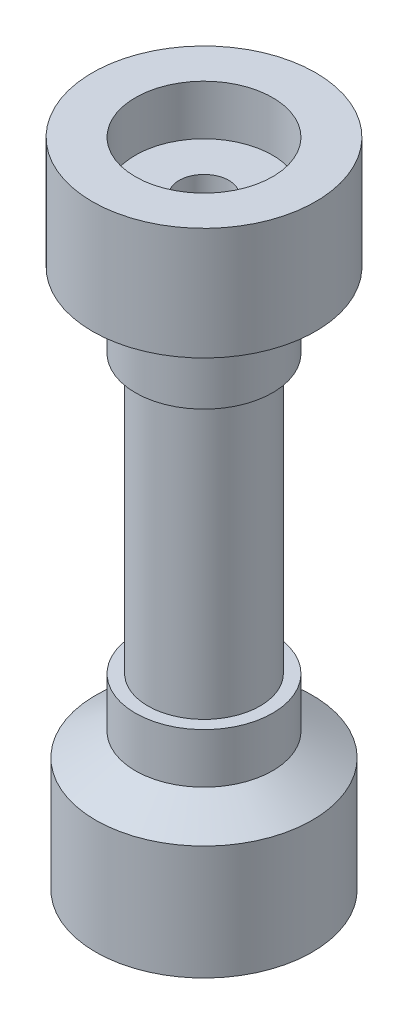
ISO-10303-21;
HEADER;
FILE_DESCRIPTION(('STEP AP214'),'2;1');
FILE_NAME('part.step','',(''),(''),'','','');
FILE_SCHEMA(('AUTOMOTIVE_DESIGN { 1 0 10303 214 1 1 1 1 }'));
ENDSEC;
DATA;
#1=APPLICATION_CONTEXT('core data for automotive mechanical design processes');
#2=APPLICATION_PROTOCOL_DEFINITION('international standard','automotive_design',2000,#1);
#3=PRODUCT_CONTEXT('',#1,'mechanical');
#4=PRODUCT('Part','Part','',(#3));
#5=PRODUCT_RELATED_PRODUCT_CATEGORY('part','',(#4));
#6=PRODUCT_DEFINITION_FORMATION('','',#4);
#7=PRODUCT_DEFINITION_CONTEXT('part definition',#1,'design');
#8=PRODUCT_DEFINITION('design','',#6,#7);
#9=PRODUCT_DEFINITION_SHAPE('','',#8);
#10=(LENGTH_UNIT() NAMED_UNIT(*) SI_UNIT(.MILLI.,.METRE.));
#11=(NAMED_UNIT(*) PLANE_ANGLE_UNIT() SI_UNIT($,.RADIAN.));
#12=(NAMED_UNIT(*) SI_UNIT($,.STERADIAN.) SOLID_ANGLE_UNIT());
#13=UNCERTAINTY_MEASURE_WITH_UNIT(LENGTH_MEASURE(1.E-05),#10,'distance_accuracy_value','');
#14=(GEOMETRIC_REPRESENTATION_CONTEXT(3) GLOBAL_UNCERTAINTY_ASSIGNED_CONTEXT((#13)) GLOBAL_UNIT_ASSIGNED_CONTEXT((#10,
#11,#12)) REPRESENTATION_CONTEXT('',''));
#15=CARTESIAN_POINT('',(0.,0.,0.));
#16=DIRECTION('',(0.,0.,1.));
#17=DIRECTION('',(1.,0.,0.));
#18=AXIS2_PLACEMENT_3D('',#15,#16,#17);
#19=CARTESIAN_POINT('',(0.,18.438364037633,0.));
#20=DIRECTION('',(0.,-1.,0.));
#21=DIRECTION('',(0.,0.,-1.));
#22=AXIS2_PLACEMENT_3D('',#19,#20,#21);
#23=PLANE('',#22);
#24=CARTESIAN_POINT('',(0.,18.438364037633,4.96669425090892));
#25=DIRECTION('',(0.,1.,0.));
#26=DIRECTION('',(0.,0.,1.));
#27=AXIS2_PLACEMENT_3D('',#24,#25,#26);
#28=CIRCLE('',#27,11.43);
#29=CARTESIAN_POINT('',(0.,18.438364037633,16.3966942509089));
#30=VERTEX_POINT('',#29);
#31=EDGE_CURVE('E85',#30,#30,#28,.T.);
#32=ORIENTED_EDGE('',*,*,#31,.F.);
#33=EDGE_LOOP('',(#32));
#34=FACE_BOUND('',#33,.T.);
#35=CARTESIAN_POINT('',(0.,18.438364037633,4.96669425090892));
#36=DIRECTION('',(0.,1.,0.));
#37=DIRECTION('',(0.,0.,1.));
#38=AXIS2_PLACEMENT_3D('',#35,#36,#37);
#39=CIRCLE('',#38,13.97);
#40=CARTESIAN_POINT('',(0.,18.438364037633,18.9366942509089));
#41=VERTEX_POINT('',#40);
#42=EDGE_CURVE('E10',#41,#41,#39,.T.);
#43=ORIENTED_EDGE('',*,*,#42,.T.);
#44=EDGE_LOOP('',(#43));
#45=FACE_BOUND('',#44,.T.);
#46=ADVANCED_FACE('F33',(#34,#45),#23,.F.);
#47=CARTESIAN_POINT('',(0.,-21.2869411304957,4.96669425090891));
#48=DIRECTION('',(0.,1.,0.));
#49=DIRECTION('',(0.,0.,1.));
#50=AXIS2_PLACEMENT_3D('',#47,#48,#49);
#51=CYLINDRICAL_SURFACE('',#50,13.97);
#52=ORIENTED_EDGE('',*,*,#42,.F.);
#53=EDGE_LOOP('',(#52));
#54=FACE_BOUND('',#53,.T.);
#55=CARTESIAN_POINT('',(0.,8.27836403763305,4.96669425090892));
#56=DIRECTION('',(0.,1.,0.));
#57=DIRECTION('',(0.,0.,1.));
#58=AXIS2_PLACEMENT_3D('',#55,#56,#57);
#59=CIRCLE('',#58,13.97);
#60=CARTESIAN_POINT('',(0.,8.27836403763305,18.9366942509089));
#61=VERTEX_POINT('',#60);
#62=EDGE_CURVE('E39',#61,#61,#59,.T.);
#63=ORIENTED_EDGE('',*,*,#62,.T.);
#64=EDGE_LOOP('',(#63));
#65=FACE_BOUND('',#64,.T.);
#66=ADVANCED_FACE('F93',(#54,#65),#51,.T.);
#67=CARTESIAN_POINT('',(0.,8.27836403763305,4.96669425090892));
#68=DIRECTION('',(0.,-1.,0.));
#69=DIRECTION('',(0.,0.,-1.));
#70=AXIS2_PLACEMENT_3D('',#67,#68,#69);
#71=CONICAL_SURFACE('',#70,13.97,1.04719755119659);
#72=CARTESIAN_POINT('',(0.,3.61092571762528,4.96669425090891));
#73=DIRECTION('',(0.,1.,0.));
#74=DIRECTION('',(0.,0.,1.));
#75=AXIS2_PLACEMENT_3D('',#72,#73,#74);
#76=CIRCLE('',#75,22.0542403114473);
#77=CARTESIAN_POINT('',(0.,3.61092571762528,27.0209345623562));
#78=VERTEX_POINT('',#77);
#79=EDGE_CURVE('E43',#78,#78,#76,.T.);
#80=ORIENTED_EDGE('',*,*,#79,.T.);
#81=EDGE_LOOP('',(#80));
#82=FACE_BOUND('',#81,.T.);
#83=ORIENTED_EDGE('',*,*,#62,.F.);
#84=EDGE_LOOP('',(#83));
#85=FACE_BOUND('',#84,.T.);
#86=ADVANCED_FACE('F97',(#82,#85),#71,.T.);
#87=CARTESIAN_POINT('',(0.,-21.2869411304957,4.96669425090891));
#88=DIRECTION('',(0.,1.,0.));
#89=DIRECTION('',(0.,0.,1.));
#90=AXIS2_PLACEMENT_3D('',#87,#88,#89);
#91=CYLINDRICAL_SURFACE('',#90,22.0542403114473);
#92=CARTESIAN_POINT('',(0.,-19.661635962367,4.96669425090891));
#93=DIRECTION('',(0.,1.,0.));
#94=DIRECTION('',(0.,0.,1.));
#95=AXIS2_PLACEMENT_3D('',#92,#93,#94);
#96=CIRCLE('',#95,22.0542403114473);
#97=CARTESIAN_POINT('',(0.,-19.661635962367,27.0209345623562));
#98=VERTEX_POINT('',#97);
#99=EDGE_CURVE('E47',#98,#98,#96,.T.);
#100=ORIENTED_EDGE('',*,*,#99,.T.);
#101=EDGE_LOOP('',(#100));
#102=FACE_BOUND('',#101,.T.);
#103=ORIENTED_EDGE('',*,*,#79,.F.);
#104=EDGE_LOOP('',(#103));
#105=FACE_BOUND('',#104,.T.);
#106=ADVANCED_FACE('F102',(#102,#105),#91,.T.);
#107=CARTESIAN_POINT('',(0.,-19.661635962367,0.));
#108=DIRECTION('',(0.,1.,0.));
#109=DIRECTION('',(0.,0.,1.));
#110=AXIS2_PLACEMENT_3D('',#107,#108,#109);
#111=PLANE('',#110);
#112=ORIENTED_EDGE('',*,*,#99,.F.);
#113=EDGE_LOOP('',(#112));
#114=FACE_BOUND('',#113,.T.);
#115=CARTESIAN_POINT('',(0.,-19.661635962367,4.96669425090891));
#116=DIRECTION('',(0.,1.,0.));
#117=DIRECTION('',(0.,0.,1.));
#118=AXIS2_PLACEMENT_3D('',#115,#116,#117);
#119=CIRCLE('',#118,13.97);
#120=CARTESIAN_POINT('',(0.,-19.661635962367,18.9366942509089));
#121=VERTEX_POINT('',#120);
#122=EDGE_CURVE('E52',#121,#121,#119,.T.);
#123=ORIENTED_EDGE('',*,*,#122,.T.);
#124=EDGE_LOOP('',(#123));
#125=FACE_BOUND('',#124,.T.);
#126=ADVANCED_FACE('F108',(#114,#125),#111,.F.);
#127=CARTESIAN_POINT('',(0.,-21.2869411304957,4.96669425090891));
#128=DIRECTION('',(0.,1.,0.));
#129=DIRECTION('',(0.,0.,1.));
#130=AXIS2_PLACEMENT_3D('',#127,#128,#129);
#131=CYLINDRICAL_SURFACE('',#130,13.97);
#132=CARTESIAN_POINT('',(0.,-9.50163596236696,4.96669425090891));
#133=DIRECTION('',(0.,1.,0.));
#134=DIRECTION('',(0.,0.,1.));
#135=AXIS2_PLACEMENT_3D('',#132,#133,#134);
#136=CIRCLE('',#135,13.97);
#137=CARTESIAN_POINT('',(0.,-9.50163596236696,18.9366942509089));
#138=VERTEX_POINT('',#137);
#139=EDGE_CURVE('E55',#138,#138,#136,.T.);
#140=ORIENTED_EDGE('',*,*,#139,.T.);
#141=EDGE_LOOP('',(#140));
#142=FACE_BOUND('',#141,.T.);
#143=ORIENTED_EDGE('',*,*,#122,.F.);
#144=EDGE_LOOP('',(#143));
#145=FACE_BOUND('',#144,.T.);
#146=ADVANCED_FACE('F112',(#142,#145),#131,.F.);
#147=CARTESIAN_POINT('',(0.,-9.50163596236696,0.));
#148=DIRECTION('',(0.,-1.,0.));
#149=DIRECTION('',(0.,0.,-1.));
#150=AXIS2_PLACEMENT_3D('',#147,#148,#149);
#151=PLANE('',#150);
#152=CARTESIAN_POINT('',(0.,-9.50163596236696,4.96669425090891));
#153=DIRECTION('',(0.,1.,0.));
#154=DIRECTION('',(0.,0.,1.));
#155=AXIS2_PLACEMENT_3D('',#152,#153,#154);
#156=CIRCLE('',#155,5.07999999999997);
#157=CARTESIAN_POINT('',(0.,-9.50163596236696,10.0466942509089));
#158=VERTEX_POINT('',#157);
#159=EDGE_CURVE('E58',#158,#158,#156,.T.);
#160=ORIENTED_EDGE('',*,*,#159,.T.);
#161=EDGE_LOOP('',(#160));
#162=FACE_BOUND('',#161,.T.);
#163=ORIENTED_EDGE('',*,*,#139,.F.);
#164=EDGE_LOOP('',(#163));
#165=FACE_BOUND('',#164,.T.);
#166=ADVANCED_FACE('F116',(#162,#165),#151,.T.);
#167=CARTESIAN_POINT('',(0.,-21.2869411304957,4.96669425090891));
#168=DIRECTION('',(0.,1.,0.));
#169=DIRECTION('',(0.,0.,1.));
#170=AXIS2_PLACEMENT_3D('',#167,#168,#169);
#171=CYLINDRICAL_SURFACE('',#170,5.07999999999997);
#172=ORIENTED_EDGE('',*,*,#159,.F.);
#173=EDGE_LOOP('',(#172));
#174=FACE_BOUND('',#173,.T.);
#175=CARTESIAN_POINT('',(0.,102.893364037633,4.96669425090893));
#176=DIRECTION('',(0.,1.,0.));
#177=DIRECTION('',(0.,0.,1.));
#178=AXIS2_PLACEMENT_3D('',#175,#176,#177);
#179=CIRCLE('',#178,5.07999999999996);
#180=CARTESIAN_POINT('',(0.,102.893364037633,10.0466942509089));
#181=VERTEX_POINT('',#180);
#182=EDGE_CURVE('E61',#181,#181,#179,.T.);
#183=ORIENTED_EDGE('',*,*,#182,.T.);
#184=EDGE_LOOP('',(#183));
#185=FACE_BOUND('',#184,.T.);
#186=ADVANCED_FACE('F120',(#174,#185),#171,.F.);
#187=CARTESIAN_POINT('',(0.,102.893364037633,0.));
#188=DIRECTION('',(0.,1.,0.));
#189=DIRECTION('',(0.,0.,1.));
#190=AXIS2_PLACEMENT_3D('',#187,#188,#189);
#191=PLANE('',#190);
#192=CARTESIAN_POINT('',(0.,102.893364037633,4.96669425090893));
#193=DIRECTION('',(0.,1.,0.));
#194=DIRECTION('',(0.,0.,1.));
#195=AXIS2_PLACEMENT_3D('',#192,#193,#194);
#196=CIRCLE('',#195,13.97);
#197=CARTESIAN_POINT('',(0.,102.893364037633,18.9366942509089));
#198=VERTEX_POINT('',#197);
#199=EDGE_CURVE('E64',#198,#198,#196,.T.);
#200=ORIENTED_EDGE('',*,*,#199,.T.);
#201=EDGE_LOOP('',(#200));
#202=FACE_BOUND('',#201,.T.);
#203=ORIENTED_EDGE('',*,*,#182,.F.);
#204=EDGE_LOOP('',(#203));
#205=FACE_BOUND('',#204,.T.);
#206=ADVANCED_FACE('F124',(#202,#205),#191,.T.);
#207=CARTESIAN_POINT('',(0.,-21.2869411304957,4.96669425090891));
#208=DIRECTION('',(0.,1.,0.));
#209=DIRECTION('',(0.,0.,1.));
#210=AXIS2_PLACEMENT_3D('',#207,#208,#209);
#211=CYLINDRICAL_SURFACE('',#210,13.97);
#212=CARTESIAN_POINT('',(0.,113.053364037633,4.96669425090893));
#213=DIRECTION('',(0.,1.,0.));
#214=DIRECTION('',(0.,0.,1.));
#215=AXIS2_PLACEMENT_3D('',#212,#213,#214);
#216=CIRCLE('',#215,13.97);
#217=CARTESIAN_POINT('',(0.,113.053364037633,18.9366942509089));
#218=VERTEX_POINT('',#217);
#219=EDGE_CURVE('E67',#218,#218,#216,.T.);
#220=ORIENTED_EDGE('',*,*,#219,.T.);
#221=EDGE_LOOP('',(#220));
#222=FACE_BOUND('',#221,.T.);
#223=ORIENTED_EDGE('',*,*,#199,.F.);
#224=EDGE_LOOP('',(#223));
#225=FACE_BOUND('',#224,.T.);
#226=ADVANCED_FACE('F128',(#222,#225),#211,.F.);
#227=CARTESIAN_POINT('',(0.,113.053364037633,0.));
#228=DIRECTION('',(0.,1.,0.));
#229=DIRECTION('',(0.,0.,1.));
#230=AXIS2_PLACEMENT_3D('',#227,#228,#229);
#231=PLANE('',#230);
#232=CARTESIAN_POINT('',(0.,113.053364037633,4.96669425090893));
#233=DIRECTION('',(0.,1.,0.));
#234=DIRECTION('',(0.,0.,1.));
#235=AXIS2_PLACEMENT_3D('',#232,#233,#234);
#236=CIRCLE('',#235,22.745142315906);
#237=CARTESIAN_POINT('',(0.,113.053364037633,27.7118365668149));
#238=VERTEX_POINT('',#237);
#239=EDGE_CURVE('E70',#238,#238,#236,.T.);
#240=ORIENTED_EDGE('',*,*,#239,.T.);
#241=EDGE_LOOP('',(#240));
#242=FACE_BOUND('',#241,.T.);
#243=ORIENTED_EDGE('',*,*,#219,.F.);
#244=EDGE_LOOP('',(#243));
#245=FACE_BOUND('',#244,.T.);
#246=ADVANCED_FACE('F132',(#242,#245),#231,.T.);
#247=CARTESIAN_POINT('',(0.,-21.2869411304957,4.96669425090891));
#248=DIRECTION('',(0.,1.,0.));
#249=DIRECTION('',(0.,0.,1.));
#250=AXIS2_PLACEMENT_3D('',#247,#248,#249);
#251=CYLINDRICAL_SURFACE('',#250,22.745142315906);
#252=CARTESIAN_POINT('',(0.,90.1796948158987,4.96669425090893));
#253=DIRECTION('',(0.,1.,0.));
#254=DIRECTION('',(0.,0.,1.));
#255=AXIS2_PLACEMENT_3D('',#252,#253,#254);
#256=CIRCLE('',#255,22.745142315906);
#257=CARTESIAN_POINT('',(0.,90.1796948158987,27.7118365668149));
#258=VERTEX_POINT('',#257);
#259=EDGE_CURVE('E73',#258,#258,#256,.T.);
#260=ORIENTED_EDGE('',*,*,#259,.T.);
#261=EDGE_LOOP('',(#260));
#262=FACE_BOUND('',#261,.T.);
#263=ORIENTED_EDGE('',*,*,#239,.F.);
#264=EDGE_LOOP('',(#263));
#265=FACE_BOUND('',#264,.T.);
#266=ADVANCED_FACE('F136',(#262,#265),#251,.T.);
#267=CARTESIAN_POINT('',(0.,85.113364037633,4.96669425090893));
#268=DIRECTION('',(0.,1.,0.));
#269=DIRECTION('',(0.,0.,1.));
#270=AXIS2_PLACEMENT_3D('',#267,#268,#269);
#271=CONICAL_SURFACE('',#270,13.97,1.04719755119659);
#272=ORIENTED_EDGE('',*,*,#259,.F.);
#273=EDGE_LOOP('',(#272));
#274=FACE_BOUND('',#273,.T.);
#275=CARTESIAN_POINT('',(0.,85.113364037633,4.96669425090893));
#276=DIRECTION('',(0.,1.,0.));
#277=DIRECTION('',(0.,0.,1.));
#278=AXIS2_PLACEMENT_3D('',#275,#276,#277);
#279=CIRCLE('',#278,13.97);
#280=CARTESIAN_POINT('',(0.,85.113364037633,18.9366942509089));
#281=VERTEX_POINT('',#280);
#282=EDGE_CURVE('E76',#281,#281,#279,.T.);
#283=ORIENTED_EDGE('',*,*,#282,.T.);
#284=EDGE_LOOP('',(#283));
#285=FACE_BOUND('',#284,.T.);
#286=ADVANCED_FACE('F140',(#274,#285),#271,.T.);
#287=CARTESIAN_POINT('',(0.,-21.2869411304957,4.96669425090891));
#288=DIRECTION('',(0.,1.,0.));
#289=DIRECTION('',(0.,0.,1.));
#290=AXIS2_PLACEMENT_3D('',#287,#288,#289);
#291=CYLINDRICAL_SURFACE('',#290,13.97);
#292=CARTESIAN_POINT('',(0.,74.9533640376331,4.96669425090893));
#293=DIRECTION('',(0.,1.,0.));
#294=DIRECTION('',(0.,0.,1.));
#295=AXIS2_PLACEMENT_3D('',#292,#293,#294);
#296=CIRCLE('',#295,13.97);
#297=CARTESIAN_POINT('',(0.,74.9533640376331,18.9366942509089));
#298=VERTEX_POINT('',#297);
#299=EDGE_CURVE('E79',#298,#298,#296,.T.);
#300=ORIENTED_EDGE('',*,*,#299,.T.);
#301=EDGE_LOOP('',(#300));
#302=FACE_BOUND('',#301,.T.);
#303=ORIENTED_EDGE('',*,*,#282,.F.);
#304=EDGE_LOOP('',(#303));
#305=FACE_BOUND('',#304,.T.);
#306=ADVANCED_FACE('F144',(#302,#305),#291,.T.);
#307=CARTESIAN_POINT('',(0.,74.9533640376331,0.));
#308=DIRECTION('',(0.,-1.,0.));
#309=DIRECTION('',(0.,0.,-1.));
#310=AXIS2_PLACEMENT_3D('',#307,#308,#309);
#311=PLANE('',#310);
#312=CARTESIAN_POINT('',(0.,74.9533640376331,4.96669425090893));
#313=DIRECTION('',(0.,1.,0.));
#314=DIRECTION('',(0.,0.,1.));
#315=AXIS2_PLACEMENT_3D('',#312,#313,#314);
#316=CIRCLE('',#315,11.43);
#317=CARTESIAN_POINT('',(0.,74.9533640376331,16.3966942509089));
#318=VERTEX_POINT('',#317);
#319=EDGE_CURVE('E82',#318,#318,#316,.T.);
#320=ORIENTED_EDGE('',*,*,#319,.T.);
#321=EDGE_LOOP('',(#320));
#322=FACE_BOUND('',#321,.T.);
#323=ORIENTED_EDGE('',*,*,#299,.F.);
#324=EDGE_LOOP('',(#323));
#325=FACE_BOUND('',#324,.T.);
#326=ADVANCED_FACE('F148',(#322,#325),#311,.T.);
#327=CARTESIAN_POINT('',(0.,-21.2869411304957,4.96669425090891));
#328=DIRECTION('',(0.,1.,0.));
#329=DIRECTION('',(0.,0.,1.));
#330=AXIS2_PLACEMENT_3D('',#327,#328,#329);
#331=CYLINDRICAL_SURFACE('',#330,11.43);
#332=ORIENTED_EDGE('',*,*,#31,.T.);
#333=EDGE_LOOP('',(#332));
#334=FACE_BOUND('',#333,.T.);
#335=ORIENTED_EDGE('',*,*,#319,.F.);
#336=EDGE_LOOP('',(#335));
#337=FACE_BOUND('',#336,.T.);
#338=ADVANCED_FACE('F89',(#334,#337),#331,.T.);
#339=CLOSED_SHELL('',(#46,#66,#86,#106,#126,#146,#166,#186,#206,#226,#246,#266,#286,#306,#326,#338));
#340=MANIFOLD_SOLID_BREP('B2',#339);
#341=ADVANCED_BREP_SHAPE_REPRESENTATION('',(#18,#340),#14);
#342=SHAPE_DEFINITION_REPRESENTATION(#9,#341);
ENDSEC;
END-ISO-10303-21;
